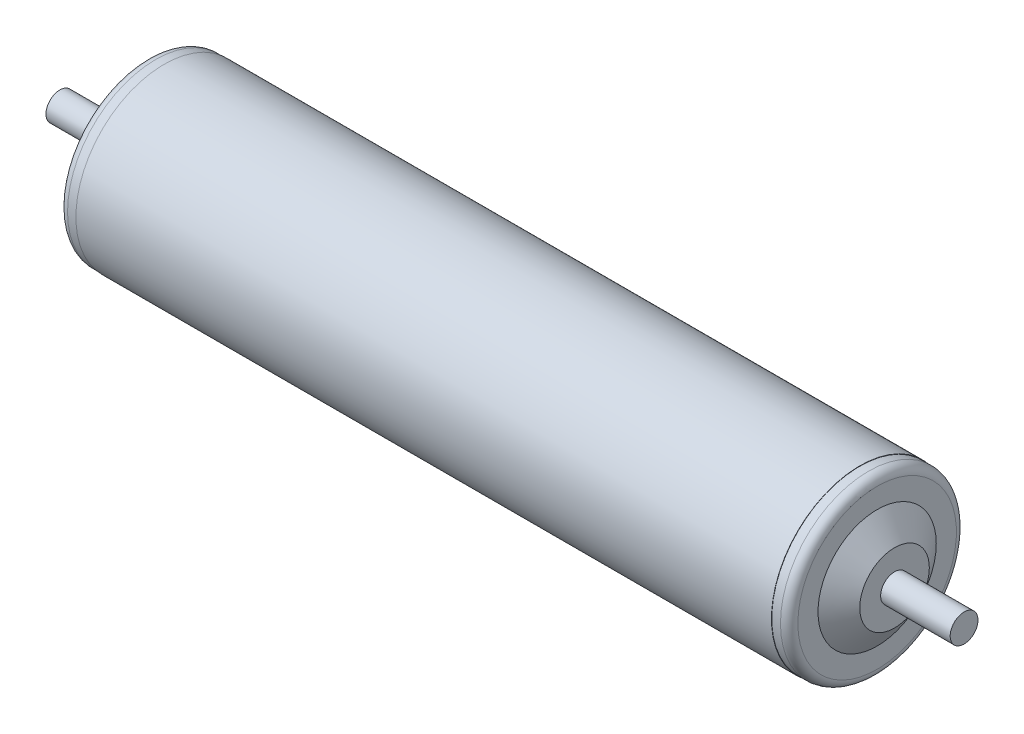
ISO-10303-21;
HEADER;
FILE_DESCRIPTION(('STEP AP214'),'2;1');
FILE_NAME('part.step','',(''),(''),'','','');
FILE_SCHEMA(('AUTOMOTIVE_DESIGN { 1 0 10303 214 1 1 1 1 }'));
ENDSEC;
DATA;
#1=APPLICATION_CONTEXT('core data for automotive mechanical design processes');
#2=APPLICATION_PROTOCOL_DEFINITION('international standard','automotive_design',2000,#1);
#3=PRODUCT_CONTEXT('',#1,'mechanical');
#4=PRODUCT('Part','Part','',(#3));
#5=PRODUCT_RELATED_PRODUCT_CATEGORY('part','',(#4));
#6=PRODUCT_DEFINITION_FORMATION('','',#4);
#7=PRODUCT_DEFINITION_CONTEXT('part definition',#1,'design');
#8=PRODUCT_DEFINITION('design','',#6,#7);
#9=PRODUCT_DEFINITION_SHAPE('','',#8);
#10=(LENGTH_UNIT() NAMED_UNIT(*) SI_UNIT(.MILLI.,.METRE.));
#11=(NAMED_UNIT(*) PLANE_ANGLE_UNIT() SI_UNIT($,.RADIAN.));
#12=(NAMED_UNIT(*) SI_UNIT($,.STERADIAN.) SOLID_ANGLE_UNIT());
#13=UNCERTAINTY_MEASURE_WITH_UNIT(LENGTH_MEASURE(1.E-05),#10,'distance_accuracy_value','');
#14=(GEOMETRIC_REPRESENTATION_CONTEXT(3) GLOBAL_UNCERTAINTY_ASSIGNED_CONTEXT((#13)) GLOBAL_UNIT_ASSIGNED_CONTEXT((#10,
#11,#12)) REPRESENTATION_CONTEXT('',''));
#15=CARTESIAN_POINT('',(0.,0.,0.));
#16=DIRECTION('',(0.,0.,1.));
#17=DIRECTION('',(1.,0.,0.));
#18=AXIS2_PLACEMENT_3D('',#15,#16,#17);
#19=CARTESIAN_POINT('',(-130.,0.,0.));
#20=DIRECTION('',(-1.,0.,0.));
#21=DIRECTION('',(0.,0.,1.));
#22=AXIS2_PLACEMENT_3D('',#19,#20,#21);
#23=PLANE('',#22);
#24=CARTESIAN_POINT('',(-130.,0.,0.));
#25=DIRECTION('',(1.,0.,0.));
#26=DIRECTION('',(0.,0.,-1.));
#27=AXIS2_PLACEMENT_3D('',#24,#25,#26);
#28=CIRCLE('',#27,4.);
#29=CARTESIAN_POINT('',(-130.,0.,-3.99999999999996));
#30=VERTEX_POINT('',#29);
#31=EDGE_CURVE('E55',#30,#30,#28,.T.);
#32=ORIENTED_EDGE('',*,*,#31,.F.);
#33=EDGE_LOOP('',(#32));
#34=FACE_BOUND('',#33,.T.);
#35=ADVANCED_FACE('F35',(#34),#23,.T.);
#36=CARTESIAN_POINT('',(130.,0.,0.));
#37=DIRECTION('',(1.,0.,0.));
#38=DIRECTION('',(0.,0.,-1.));
#39=AXIS2_PLACEMENT_3D('',#36,#37,#38);
#40=CYLINDRICAL_SURFACE('',#39,3.99999999999999);
#41=ORIENTED_EDGE('',*,*,#31,.T.);
#42=EDGE_LOOP('',(#41));
#43=FACE_BOUND('',#42,.T.);
#44=CARTESIAN_POINT('',(-110.,0.,0.));
#45=DIRECTION('',(1.,0.,0.));
#46=DIRECTION('',(0.,0.,-1.));
#47=AXIS2_PLACEMENT_3D('',#44,#45,#46);
#48=CIRCLE('',#47,3.99999999999999);
#49=CARTESIAN_POINT('',(-110.,0.,-3.99999999999996));
#50=VERTEX_POINT('',#49);
#51=EDGE_CURVE('E58',#50,#50,#48,.T.);
#52=ORIENTED_EDGE('',*,*,#51,.F.);
#53=EDGE_LOOP('',(#52));
#54=FACE_BOUND('',#53,.T.);
#55=ADVANCED_FACE('F122',(#43,#54),#40,.T.);
#56=CARTESIAN_POINT('',(-110.,0.,0.));
#57=DIRECTION('',(-1.,0.,0.));
#58=DIRECTION('',(0.,0.,1.));
#59=AXIS2_PLACEMENT_3D('',#56,#57,#58);
#60=PLANE('',#59);
#61=ORIENTED_EDGE('',*,*,#51,.T.);
#62=EDGE_LOOP('',(#61));
#63=FACE_BOUND('',#62,.T.);
#64=CARTESIAN_POINT('',(-110.,0.,0.));
#65=DIRECTION('',(1.,0.,0.));
#66=DIRECTION('',(0.,0.,-1.));
#67=AXIS2_PLACEMENT_3D('',#64,#65,#66);
#68=CIRCLE('',#67,10.);
#69=CARTESIAN_POINT('',(-110.,0.,-9.99999999999996));
#70=VERTEX_POINT('',#69);
#71=EDGE_CURVE('E61',#70,#70,#68,.T.);
#72=ORIENTED_EDGE('',*,*,#71,.F.);
#73=EDGE_LOOP('',(#72));
#74=FACE_BOUND('',#73,.T.);
#75=ADVANCED_FACE('F128',(#63,#74),#60,.T.);
#76=CARTESIAN_POINT('',(-105.,0.,0.));
#77=DIRECTION('',(1.,0.,0.));
#78=DIRECTION('',(0.,0.,-1.));
#79=AXIS2_PLACEMENT_3D('',#76,#77,#78);
#80=CONICAL_SURFACE('',#79,17.,0.950546840812078);
#81=ORIENTED_EDGE('',*,*,#71,.T.);
#82=EDGE_LOOP('',(#81));
#83=FACE_BOUND('',#82,.T.);
#84=CARTESIAN_POINT('',(-105.,0.,0.));
#85=DIRECTION('',(1.,0.,0.));
#86=DIRECTION('',(0.,0.,-1.));
#87=AXIS2_PLACEMENT_3D('',#84,#85,#86);
#88=CIRCLE('',#87,17.);
#89=CARTESIAN_POINT('',(-105.,0.,-17.));
#90=VERTEX_POINT('',#89);
#91=EDGE_CURVE('E64',#90,#90,#88,.T.);
#92=ORIENTED_EDGE('',*,*,#91,.F.);
#93=EDGE_LOOP('',(#92));
#94=FACE_BOUND('',#93,.T.);
#95=ADVANCED_FACE('F172',(#83,#94),#80,.T.);
#96=CARTESIAN_POINT('',(-105.,0.,0.));
#97=DIRECTION('',(-1.,0.,0.));
#98=DIRECTION('',(0.,0.,1.));
#99=AXIS2_PLACEMENT_3D('',#96,#97,#98);
#100=PLANE('',#99);
#101=CARTESIAN_POINT('',(-105.,0.,0.));
#102=DIRECTION('',(-1.,0.,0.));
#103=DIRECTION('',(0.,0.,1.));
#104=AXIS2_PLACEMENT_3D('',#101,#102,#103);
#105=CIRCLE('',#104,22.8);
#106=CARTESIAN_POINT('',(-105.,0.,22.8));
#107=VERTEX_POINT('',#106);
#108=EDGE_CURVE('E46',#107,#107,#105,.T.);
#109=ORIENTED_EDGE('',*,*,#108,.T.);
#110=EDGE_LOOP('',(#109));
#111=FACE_BOUND('',#110,.T.);
#112=ORIENTED_EDGE('',*,*,#91,.T.);
#113=EDGE_LOOP('',(#112));
#114=FACE_BOUND('',#113,.T.);
#115=ADVANCED_FACE('F150',(#111,#114),#100,.T.);
#116=CARTESIAN_POINT('',(130.,0.,0.));
#117=DIRECTION('',(1.,0.,0.));
#118=DIRECTION('',(0.,0.,-1.));
#119=AXIS2_PLACEMENT_3D('',#116,#117,#118);
#120=CYLINDRICAL_SURFACE('',#119,25.3);
#121=CARTESIAN_POINT('',(-102.5,0.,0.));
#122=DIRECTION('',(-1.,0.,0.));
#123=DIRECTION('',(0.,0.,1.));
#124=AXIS2_PLACEMENT_3D('',#121,#122,#123);
#125=CIRCLE('',#124,25.3);
#126=CARTESIAN_POINT('',(-102.5,0.,25.3));
#127=VERTEX_POINT('',#126);
#128=EDGE_CURVE('E50',#127,#127,#125,.F.);
#129=ORIENTED_EDGE('',*,*,#128,.T.);
#130=EDGE_LOOP('',(#129));
#131=FACE_BOUND('',#130,.T.);
#132=CARTESIAN_POINT('',(-100.,0.,0.));
#133=DIRECTION('',(1.,0.,0.));
#134=DIRECTION('',(0.,0.,-1.));
#135=AXIS2_PLACEMENT_3D('',#132,#133,#134);
#136=CIRCLE('',#135,25.3);
#137=CARTESIAN_POINT('',(-100.,0.,-25.3));
#138=VERTEX_POINT('',#137);
#139=EDGE_CURVE('E67',#138,#138,#136,.T.);
#140=ORIENTED_EDGE('',*,*,#139,.F.);
#141=EDGE_LOOP('',(#140));
#142=FACE_BOUND('',#141,.T.);
#143=ADVANCED_FACE('F146',(#131,#142),#120,.T.);
#144=CARTESIAN_POINT('',(-100.,0.,0.));
#145=DIRECTION('',(-1.,0.,0.));
#146=DIRECTION('',(0.,0.,1.));
#147=AXIS2_PLACEMENT_3D('',#144,#145,#146);
#148=PLANE('',#147);
#149=ORIENTED_EDGE('',*,*,#139,.T.);
#150=EDGE_LOOP('',(#149));
#151=FACE_BOUND('',#150,.T.);
#152=CARTESIAN_POINT('',(-100.,0.,0.));
#153=DIRECTION('',(1.,0.,0.));
#154=DIRECTION('',(0.,0.,-1.));
#155=AXIS2_PLACEMENT_3D('',#152,#153,#154);
#156=CIRCLE('',#155,25.4);
#157=CARTESIAN_POINT('',(-100.,0.,-25.4));
#158=VERTEX_POINT('',#157);
#159=EDGE_CURVE('E70',#158,#158,#156,.T.);
#160=ORIENTED_EDGE('',*,*,#159,.F.);
#161=EDGE_LOOP('',(#160));
#162=FACE_BOUND('',#161,.T.);
#163=ADVANCED_FACE('F149',(#151,#162),#148,.T.);
#164=CARTESIAN_POINT('',(130.,0.,0.));
#165=DIRECTION('',(1.,0.,0.));
#166=DIRECTION('',(0.,0.,-1.));
#167=AXIS2_PLACEMENT_3D('',#164,#165,#166);
#168=CYLINDRICAL_SURFACE('',#167,25.4);
#169=CARTESIAN_POINT('',(100.,0.,0.));
#170=DIRECTION('',(1.,0.,0.));
#171=DIRECTION('',(0.,0.,-1.));
#172=AXIS2_PLACEMENT_3D('',#169,#170,#171);
#173=CIRCLE('',#172,25.4);
#174=CARTESIAN_POINT('',(100.,0.,-25.4));
#175=VERTEX_POINT('',#174);
#176=EDGE_CURVE('E73',#175,#175,#173,.T.);
#177=ORIENTED_EDGE('',*,*,#176,.F.);
#178=EDGE_LOOP('',(#177));
#179=FACE_BOUND('',#178,.T.);
#180=ORIENTED_EDGE('',*,*,#159,.T.);
#181=EDGE_LOOP('',(#180));
#182=FACE_BOUND('',#181,.T.);
#183=ADVANCED_FACE('F156',(#179,#182),#168,.T.);
#184=CARTESIAN_POINT('',(100.,0.,0.));
#185=DIRECTION('',(-1.,0.,0.));
#186=DIRECTION('',(0.,0.,1.));
#187=AXIS2_PLACEMENT_3D('',#184,#185,#186);
#188=PLANE('',#187);
#189=CARTESIAN_POINT('',(100.,0.,0.));
#190=DIRECTION('',(1.,0.,0.));
#191=DIRECTION('',(0.,0.,-1.));
#192=AXIS2_PLACEMENT_3D('',#189,#190,#191);
#193=CIRCLE('',#192,25.3);
#194=CARTESIAN_POINT('',(100.,0.,-25.3));
#195=VERTEX_POINT('',#194);
#196=EDGE_CURVE('E76',#195,#195,#193,.T.);
#197=ORIENTED_EDGE('',*,*,#196,.F.);
#198=EDGE_LOOP('',(#197));
#199=FACE_BOUND('',#198,.T.);
#200=ORIENTED_EDGE('',*,*,#176,.T.);
#201=EDGE_LOOP('',(#200));
#202=FACE_BOUND('',#201,.T.);
#203=ADVANCED_FACE('F119',(#199,#202),#188,.F.);
#204=CARTESIAN_POINT('',(130.,0.,0.));
#205=DIRECTION('',(1.,0.,0.));
#206=DIRECTION('',(0.,0.,-1.));
#207=AXIS2_PLACEMENT_3D('',#204,#205,#206);
#208=CYLINDRICAL_SURFACE('',#207,25.3);
#209=CARTESIAN_POINT('',(102.5,0.,0.));
#210=DIRECTION('',(-1.,0.,0.));
#211=DIRECTION('',(0.,0.,1.));
#212=AXIS2_PLACEMENT_3D('',#209,#210,#211);
#213=CIRCLE('',#212,25.3);
#214=CARTESIAN_POINT('',(102.5,0.,25.3));
#215=VERTEX_POINT('',#214);
#216=EDGE_CURVE('E10',#215,#215,#213,.T.);
#217=ORIENTED_EDGE('',*,*,#216,.T.);
#218=EDGE_LOOP('',(#217));
#219=FACE_BOUND('',#218,.T.);
#220=ORIENTED_EDGE('',*,*,#196,.T.);
#221=EDGE_LOOP('',(#220));
#222=FACE_BOUND('',#221,.T.);
#223=ADVANCED_FACE('F114',(#219,#222),#208,.T.);
#224=CARTESIAN_POINT('',(105.,0.,0.));
#225=DIRECTION('',(-1.,0.,0.));
#226=DIRECTION('',(0.,0.,1.));
#227=AXIS2_PLACEMENT_3D('',#224,#225,#226);
#228=PLANE('',#227);
#229=CARTESIAN_POINT('',(105.,0.,0.));
#230=DIRECTION('',(-1.,0.,0.));
#231=DIRECTION('',(0.,0.,1.));
#232=AXIS2_PLACEMENT_3D('',#229,#230,#231);
#233=CIRCLE('',#232,22.8);
#234=CARTESIAN_POINT('',(105.,0.,22.8));
#235=VERTEX_POINT('',#234);
#236=EDGE_CURVE('E42',#235,#235,#233,.F.);
#237=ORIENTED_EDGE('',*,*,#236,.T.);
#238=EDGE_LOOP('',(#237));
#239=FACE_BOUND('',#238,.T.);
#240=CARTESIAN_POINT('',(105.,0.,0.));
#241=DIRECTION('',(1.,0.,0.));
#242=DIRECTION('',(0.,0.,-1.));
#243=AXIS2_PLACEMENT_3D('',#240,#241,#242);
#244=CIRCLE('',#243,17.);
#245=CARTESIAN_POINT('',(105.,0.,-17.));
#246=VERTEX_POINT('',#245);
#247=EDGE_CURVE('E79',#246,#246,#244,.T.);
#248=ORIENTED_EDGE('',*,*,#247,.F.);
#249=EDGE_LOOP('',(#248));
#250=FACE_BOUND('',#249,.T.);
#251=ADVANCED_FACE('F109',(#239,#250),#228,.F.);
#252=CARTESIAN_POINT('',(105.,0.,0.));
#253=DIRECTION('',(-1.,0.,0.));
#254=DIRECTION('',(0.,0.,1.));
#255=AXIS2_PLACEMENT_3D('',#252,#253,#254);
#256=CONICAL_SURFACE('',#255,17.,0.950546840812079);
#257=CARTESIAN_POINT('',(110.,0.,0.));
#258=DIRECTION('',(1.,0.,0.));
#259=DIRECTION('',(0.,0.,-1.));
#260=AXIS2_PLACEMENT_3D('',#257,#258,#259);
#261=CIRCLE('',#260,9.99999999999999);
#262=CARTESIAN_POINT('',(110.,0.,-9.99999999999998));
#263=VERTEX_POINT('',#262);
#264=EDGE_CURVE('E82',#263,#263,#261,.T.);
#265=ORIENTED_EDGE('',*,*,#264,.F.);
#266=EDGE_LOOP('',(#265));
#267=FACE_BOUND('',#266,.T.);
#268=ORIENTED_EDGE('',*,*,#247,.T.);
#269=EDGE_LOOP('',(#268));
#270=FACE_BOUND('',#269,.T.);
#271=ADVANCED_FACE('F103',(#267,#270),#256,.T.);
#272=CARTESIAN_POINT('',(110.,0.,0.));
#273=DIRECTION('',(-1.,0.,0.));
#274=DIRECTION('',(0.,0.,1.));
#275=AXIS2_PLACEMENT_3D('',#272,#273,#274);
#276=PLANE('',#275);
#277=CARTESIAN_POINT('',(110.,0.,0.));
#278=DIRECTION('',(1.,0.,0.));
#279=DIRECTION('',(0.,0.,-1.));
#280=AXIS2_PLACEMENT_3D('',#277,#278,#279);
#281=CIRCLE('',#280,3.99999999999999);
#282=CARTESIAN_POINT('',(110.,0.,-3.99999999999999));
#283=VERTEX_POINT('',#282);
#284=EDGE_CURVE('E85',#283,#283,#281,.T.);
#285=ORIENTED_EDGE('',*,*,#284,.F.);
#286=EDGE_LOOP('',(#285));
#287=FACE_BOUND('',#286,.T.);
#288=ORIENTED_EDGE('',*,*,#264,.T.);
#289=EDGE_LOOP('',(#288));
#290=FACE_BOUND('',#289,.T.);
#291=ADVANCED_FACE('F97',(#287,#290),#276,.F.);
#292=CARTESIAN_POINT('',(130.,0.,0.));
#293=DIRECTION('',(1.,0.,0.));
#294=DIRECTION('',(0.,0.,-1.));
#295=AXIS2_PLACEMENT_3D('',#292,#293,#294);
#296=CYLINDRICAL_SURFACE('',#295,3.99999999999999);
#297=CARTESIAN_POINT('',(130.,0.,0.));
#298=DIRECTION('',(1.,0.,0.));
#299=DIRECTION('',(0.,0.,-1.));
#300=AXIS2_PLACEMENT_3D('',#297,#298,#299);
#301=CIRCLE('',#300,4.);
#302=CARTESIAN_POINT('',(130.,0.,-3.99999999999999));
#303=VERTEX_POINT('',#302);
#304=EDGE_CURVE('E88',#303,#303,#301,.T.);
#305=ORIENTED_EDGE('',*,*,#304,.F.);
#306=EDGE_LOOP('',(#305));
#307=FACE_BOUND('',#306,.T.);
#308=ORIENTED_EDGE('',*,*,#284,.T.);
#309=EDGE_LOOP('',(#308));
#310=FACE_BOUND('',#309,.T.);
#311=ADVANCED_FACE('F94',(#307,#310),#296,.T.);
#312=CARTESIAN_POINT('',(130.,0.,0.));
#313=DIRECTION('',(-1.,0.,0.));
#314=DIRECTION('',(0.,0.,1.));
#315=AXIS2_PLACEMENT_3D('',#312,#313,#314);
#316=PLANE('',#315);
#317=ORIENTED_EDGE('',*,*,#304,.T.);
#318=EDGE_LOOP('',(#317));
#319=FACE_BOUND('',#318,.T.);
#320=ADVANCED_FACE('F92',(#319),#316,.F.);
#321=CARTESIAN_POINT('',(-102.5,0.,0.));
#322=DIRECTION('',(-1.,0.,0.));
#323=DIRECTION('',(0.,0.,1.));
#324=AXIS2_PLACEMENT_3D('',#321,#322,#323);
#325=TOROIDAL_SURFACE('',#324,22.8,2.5);
#326=ORIENTED_EDGE('',*,*,#108,.F.);
#327=EDGE_LOOP('',(#326));
#328=FACE_BOUND('',#327,.T.);
#329=ORIENTED_EDGE('',*,*,#128,.F.);
#330=EDGE_LOOP('',(#329));
#331=FACE_BOUND('',#330,.T.);
#332=ADVANCED_FACE('F133',(#328,#331),#325,.T.);
#333=CARTESIAN_POINT('',(102.5,0.,0.));
#334=DIRECTION('',(-1.,0.,0.));
#335=DIRECTION('',(0.,0.,1.));
#336=AXIS2_PLACEMENT_3D('',#333,#334,#335);
#337=TOROIDAL_SURFACE('',#336,22.8,2.5);
#338=ORIENTED_EDGE('',*,*,#216,.F.);
#339=EDGE_LOOP('',(#338));
#340=FACE_BOUND('',#339,.T.);
#341=ORIENTED_EDGE('',*,*,#236,.F.);
#342=EDGE_LOOP('',(#341));
#343=FACE_BOUND('',#342,.T.);
#344=ADVANCED_FACE('F37',(#340,#343),#337,.T.);
#345=CLOSED_SHELL('',(#35,#55,#75,#95,#115,#143,#163,#183,#203,#223,#251,#271,#291,#311,#320,
#332,#344));
#346=MANIFOLD_SOLID_BREP('B2',#345);
#347=ADVANCED_BREP_SHAPE_REPRESENTATION('',(#18,#346),#14);
#348=SHAPE_DEFINITION_REPRESENTATION(#9,#347);
ENDSEC;
END-ISO-10303-21;
